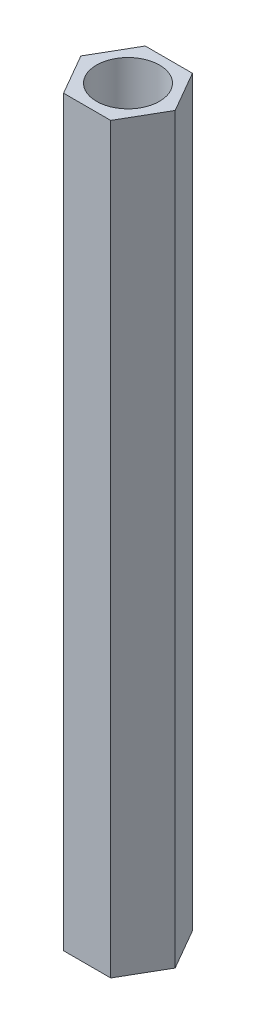
ISO-10303-21;
HEADER;
FILE_DESCRIPTION(('STEP AP214'),'2;1');
FILE_NAME('part.step','',(''),(''),'','','');
FILE_SCHEMA(('AUTOMOTIVE_DESIGN { 1 0 10303 214 1 1 1 1 }'));
ENDSEC;
DATA;
#1=APPLICATION_CONTEXT('core data for automotive mechanical design processes');
#2=APPLICATION_PROTOCOL_DEFINITION('international standard','automotive_design',2000,#1);
#3=PRODUCT_CONTEXT('',#1,'mechanical');
#4=PRODUCT('Part','Part','',(#3));
#5=PRODUCT_RELATED_PRODUCT_CATEGORY('part','',(#4));
#6=PRODUCT_DEFINITION_FORMATION('','',#4);
#7=PRODUCT_DEFINITION_CONTEXT('part definition',#1,'design');
#8=PRODUCT_DEFINITION('design','',#6,#7);
#9=PRODUCT_DEFINITION_SHAPE('','',#8);
#10=(LENGTH_UNIT() NAMED_UNIT(*) SI_UNIT(.MILLI.,.METRE.));
#11=(NAMED_UNIT(*) PLANE_ANGLE_UNIT() SI_UNIT($,.RADIAN.));
#12=(NAMED_UNIT(*) SI_UNIT($,.STERADIAN.) SOLID_ANGLE_UNIT());
#13=UNCERTAINTY_MEASURE_WITH_UNIT(LENGTH_MEASURE(1.E-05),#10,'distance_accuracy_value','');
#14=(GEOMETRIC_REPRESENTATION_CONTEXT(3) GLOBAL_UNCERTAINTY_ASSIGNED_CONTEXT((#13)) GLOBAL_UNIT_ASSIGNED_CONTEXT((#10,
#11,#12)) REPRESENTATION_CONTEXT('',''));
#15=CARTESIAN_POINT('',(0.,0.,0.));
#16=DIRECTION('',(0.,0.,1.));
#17=DIRECTION('',(1.,0.,0.));
#18=AXIS2_PLACEMENT_3D('',#15,#16,#17);
#19=CARTESIAN_POINT('',(0.952627944162881,30.,1.65000000000002));
#20=DIRECTION('',(-0.866025403784439,0.,-0.499999999999999));
#21=DIRECTION('',(-0.499999999999999,0.,0.866025403784439));
#22=AXIS2_PLACEMENT_3D('',#19,#20,#21);
#23=PLANE('',#22);
#24=DIRECTION('',(0.499999999999999,0.,-0.866025403784439));
#25=VECTOR('',#24,1.);
#26=CARTESIAN_POINT('',(0.952627944162881,0.,1.65000000000002));
#27=LINE('',#26,#25);
#28=CARTESIAN_POINT('',(0.952627944162881,0.,1.65000000000002));
#29=VERTEX_POINT('',#28);
#30=CARTESIAN_POINT('',(1.90525588832577,0.,0.));
#31=VERTEX_POINT('',#30);
#32=EDGE_CURVE('E117',#29,#31,#27,.T.);
#33=ORIENTED_EDGE('',*,*,#32,.T.);
#34=DIRECTION('',(0.,-1.,0.));
#35=VECTOR('',#34,1.);
#36=CARTESIAN_POINT('',(1.90525588832577,30.,0.));
#37=LINE('',#36,#35);
#38=CARTESIAN_POINT('',(1.90525588832577,30.,0.));
#39=VERTEX_POINT('',#38);
#40=EDGE_CURVE('E11',#39,#31,#37,.T.);
#41=ORIENTED_EDGE('',*,*,#40,.F.);
#42=DIRECTION('',(0.499999999999999,0.,-0.866025403784439));
#43=VECTOR('',#42,1.);
#44=CARTESIAN_POINT('',(0.952627944162881,30.,1.65000000000002));
#45=LINE('',#44,#43);
#46=CARTESIAN_POINT('',(0.952627944162881,30.,1.65000000000002));
#47=VERTEX_POINT('',#46);
#48=EDGE_CURVE('E128',#47,#39,#45,.T.);
#49=ORIENTED_EDGE('',*,*,#48,.F.);
#50=DIRECTION('',(0.,-1.,0.));
#51=VECTOR('',#50,1.);
#52=CARTESIAN_POINT('',(0.952627944162881,30.,1.65000000000002));
#53=LINE('',#52,#51);
#54=EDGE_CURVE('E113',#47,#29,#53,.T.);
#55=ORIENTED_EDGE('',*,*,#54,.T.);
#56=EDGE_LOOP('',(#33,#41,#49,#55));
#57=FACE_BOUND('',#56,.T.);
#58=ADVANCED_FACE('F33',(#57),#23,.F.);
#59=CARTESIAN_POINT('',(1.90525588832577,30.,0.));
#60=DIRECTION('',(-0.866025403784438,0.,0.500000000000002));
#61=DIRECTION('',(0.500000000000002,0.,0.866025403784438));
#62=AXIS2_PLACEMENT_3D('',#59,#60,#61);
#63=PLANE('',#62);
#64=DIRECTION('',(-0.500000000000002,0.,-0.866025403784437));
#65=VECTOR('',#64,1.);
#66=CARTESIAN_POINT('',(1.90525588832577,0.,0.));
#67=LINE('',#66,#65);
#68=CARTESIAN_POINT('',(0.952627944162867,0.,-1.65000000000002));
#69=VERTEX_POINT('',#68);
#70=EDGE_CURVE('E120',#31,#69,#67,.T.);
#71=ORIENTED_EDGE('',*,*,#70,.T.);
#72=DIRECTION('',(0.,-1.,0.));
#73=VECTOR('',#72,1.);
#74=CARTESIAN_POINT('',(0.952627944162867,30.,-1.65000000000002));
#75=LINE('',#74,#73);
#76=CARTESIAN_POINT('',(0.952627944162867,30.,-1.65000000000002));
#77=VERTEX_POINT('',#76);
#78=EDGE_CURVE('E41',#77,#69,#75,.T.);
#79=ORIENTED_EDGE('',*,*,#78,.F.);
#80=DIRECTION('',(-0.500000000000002,0.,-0.866025403784437));
#81=VECTOR('',#80,1.);
#82=CARTESIAN_POINT('',(1.90525588832577,30.,0.));
#83=LINE('',#82,#81);
#84=EDGE_CURVE('E86',#39,#77,#83,.T.);
#85=ORIENTED_EDGE('',*,*,#84,.F.);
#86=ORIENTED_EDGE('',*,*,#40,.T.);
#87=EDGE_LOOP('',(#71,#79,#85,#86));
#88=FACE_BOUND('',#87,.T.);
#89=ADVANCED_FACE('F153',(#88),#63,.F.);
#90=CARTESIAN_POINT('',(0.952627944162867,30.,-1.65000000000002));
#91=DIRECTION('',(0.,0.,1.));
#92=DIRECTION('',(1.,0.,0.));
#93=AXIS2_PLACEMENT_3D('',#90,#91,#92);
#94=PLANE('',#93);
#95=DIRECTION('',(-1.,0.,0.));
#96=VECTOR('',#95,1.);
#97=CARTESIAN_POINT('',(0.952627944162867,0.,-1.65000000000002));
#98=LINE('',#97,#96);
#99=CARTESIAN_POINT('',(-0.952627944162891,0.,-1.65000000000002));
#100=VERTEX_POINT('',#99);
#101=EDGE_CURVE('E123',#69,#100,#98,.T.);
#102=ORIENTED_EDGE('',*,*,#101,.T.);
#103=DIRECTION('',(0.,-1.,0.));
#104=VECTOR('',#103,1.);
#105=CARTESIAN_POINT('',(-0.952627944162891,30.,-1.65000000000002));
#106=LINE('',#105,#104);
#107=CARTESIAN_POINT('',(-0.952627944162891,30.,-1.65000000000002));
#108=VERTEX_POINT('',#107);
#109=EDGE_CURVE('E108',#108,#100,#106,.T.);
#110=ORIENTED_EDGE('',*,*,#109,.F.);
#111=DIRECTION('',(-1.,0.,0.));
#112=VECTOR('',#111,1.);
#113=CARTESIAN_POINT('',(0.952627944162867,30.,-1.65000000000002));
#114=LINE('',#113,#112);
#115=EDGE_CURVE('E99',#77,#108,#114,.T.);
#116=ORIENTED_EDGE('',*,*,#115,.F.);
#117=ORIENTED_EDGE('',*,*,#78,.T.);
#118=EDGE_LOOP('',(#102,#110,#116,#117));
#119=FACE_BOUND('',#118,.T.);
#120=ADVANCED_FACE('F134',(#119),#94,.F.);
#121=CARTESIAN_POINT('',(-0.952627944162891,30.,-1.65000000000002));
#122=DIRECTION('',(0.866025403784439,0.,0.499999999999999));
#123=DIRECTION('',(0.5,0.,-0.866025403784439));
#124=AXIS2_PLACEMENT_3D('',#121,#122,#123);
#125=PLANE('',#124);
#126=DIRECTION('',(-0.5,0.,0.866025403784439));
#127=VECTOR('',#126,1.);
#128=CARTESIAN_POINT('',(-0.952627944162891,0.,-1.65000000000002));
#129=LINE('',#128,#127);
#130=CARTESIAN_POINT('',(-1.90525588832578,0.,0.));
#131=VERTEX_POINT('',#130);
#132=EDGE_CURVE('E107',#100,#131,#129,.T.);
#133=ORIENTED_EDGE('',*,*,#132,.T.);
#134=DIRECTION('',(0.,-1.,0.));
#135=VECTOR('',#134,1.);
#136=CARTESIAN_POINT('',(-1.90525588832578,30.,0.));
#137=LINE('',#136,#135);
#138=CARTESIAN_POINT('',(-1.90525588832578,30.,0.));
#139=VERTEX_POINT('',#138);
#140=EDGE_CURVE('E104',#139,#131,#137,.T.);
#141=ORIENTED_EDGE('',*,*,#140,.F.);
#142=DIRECTION('',(-0.5,0.,0.866025403784439));
#143=VECTOR('',#142,1.);
#144=CARTESIAN_POINT('',(-0.952627944162891,30.,-1.65000000000002));
#145=LINE('',#144,#143);
#146=EDGE_CURVE('E93',#108,#139,#145,.T.);
#147=ORIENTED_EDGE('',*,*,#146,.F.);
#148=ORIENTED_EDGE('',*,*,#109,.T.);
#149=EDGE_LOOP('',(#133,#141,#147,#148));
#150=FACE_BOUND('',#149,.T.);
#151=ADVANCED_FACE('F105',(#150),#125,.F.);
#152=CARTESIAN_POINT('',(-1.90525588832578,30.,0.));
#153=DIRECTION('',(0.86602540378444,0.,-0.499999999999998));
#154=DIRECTION('',(-0.499999999999998,0.,-0.86602540378444));
#155=AXIS2_PLACEMENT_3D('',#152,#153,#154);
#156=PLANE('',#155);
#157=DIRECTION('',(0.499999999999998,0.,0.86602540378444));
#158=VECTOR('',#157,1.);
#159=CARTESIAN_POINT('',(-1.90525588832578,0.,0.));
#160=LINE('',#159,#158);
#161=CARTESIAN_POINT('',(-0.952627944162891,0.,1.65000000000002));
#162=VERTEX_POINT('',#161);
#163=EDGE_CURVE('E72',#131,#162,#160,.T.);
#164=ORIENTED_EDGE('',*,*,#163,.T.);
#165=DIRECTION('',(0.,-1.,0.));
#166=VECTOR('',#165,1.);
#167=CARTESIAN_POINT('',(-0.952627944162891,30.,1.65000000000002));
#168=LINE('',#167,#166);
#169=CARTESIAN_POINT('',(-0.952627944162891,30.,1.65000000000002));
#170=VERTEX_POINT('',#169);
#171=EDGE_CURVE('E109',#170,#162,#168,.T.);
#172=ORIENTED_EDGE('',*,*,#171,.F.);
#173=DIRECTION('',(0.499999999999998,0.,0.86602540378444));
#174=VECTOR('',#173,1.);
#175=CARTESIAN_POINT('',(-1.90525588832578,30.,0.));
#176=LINE('',#175,#174);
#177=EDGE_CURVE('E97',#139,#170,#176,.T.);
#178=ORIENTED_EDGE('',*,*,#177,.F.);
#179=ORIENTED_EDGE('',*,*,#140,.T.);
#180=EDGE_LOOP('',(#164,#172,#178,#179));
#181=FACE_BOUND('',#180,.T.);
#182=ADVANCED_FACE('F111',(#181),#156,.F.);
#183=CARTESIAN_POINT('',(-0.952627944162891,30.,1.65000000000002));
#184=DIRECTION('',(0.,0.,-1.));
#185=DIRECTION('',(-1.,0.,0.));
#186=AXIS2_PLACEMENT_3D('',#183,#184,#185);
#187=PLANE('',#186);
#188=DIRECTION('',(1.,0.,0.));
#189=VECTOR('',#188,1.);
#190=CARTESIAN_POINT('',(-0.952627944162891,0.,1.65000000000002));
#191=LINE('',#190,#189);
#192=EDGE_CURVE('E78',#162,#29,#191,.T.);
#193=ORIENTED_EDGE('',*,*,#192,.T.);
#194=ORIENTED_EDGE('',*,*,#54,.F.);
#195=DIRECTION('',(1.,0.,0.));
#196=VECTOR('',#195,1.);
#197=CARTESIAN_POINT('',(-0.952627944162891,30.,1.65000000000002));
#198=LINE('',#197,#196);
#199=EDGE_CURVE('E49',#170,#47,#198,.T.);
#200=ORIENTED_EDGE('',*,*,#199,.F.);
#201=ORIENTED_EDGE('',*,*,#171,.T.);
#202=EDGE_LOOP('',(#193,#194,#200,#201));
#203=FACE_BOUND('',#202,.T.);
#204=ADVANCED_FACE('F141',(#203),#187,.F.);
#205=CARTESIAN_POINT('',(0.,30.,0.));
#206=DIRECTION('',(0.,1.,0.));
#207=DIRECTION('',(0.,0.,1.));
#208=AXIS2_PLACEMENT_3D('',#205,#206,#207);
#209=PLANE('',#208);
#210=CARTESIAN_POINT('',(0.,30.,0.));
#211=DIRECTION('',(0.,1.,0.));
#212=DIRECTION('',(0.,0.,1.));
#213=AXIS2_PLACEMENT_3D('',#210,#211,#212);
#214=CIRCLE('',#213,1.27161304615697);
#215=CARTESIAN_POINT('',(0.,30.,1.27161304615697));
#216=VERTEX_POINT('',#215);
#217=EDGE_CURVE('E208',#216,#216,#214,.T.);
#218=ORIENTED_EDGE('',*,*,#217,.F.);
#219=EDGE_LOOP('',(#218));
#220=FACE_BOUND('',#219,.T.);
#221=ORIENTED_EDGE('',*,*,#48,.T.);
#222=ORIENTED_EDGE('',*,*,#84,.T.);
#223=ORIENTED_EDGE('',*,*,#115,.T.);
#224=ORIENTED_EDGE('',*,*,#146,.T.);
#225=ORIENTED_EDGE('',*,*,#177,.T.);
#226=ORIENTED_EDGE('',*,*,#199,.T.);
#227=EDGE_LOOP('',(#221,#222,#223,#224,#225,#226));
#228=FACE_BOUND('',#227,.T.);
#229=ADVANCED_FACE('F95',(#220,#228),#209,.T.);
#230=CARTESIAN_POINT('',(0.,0.,0.));
#231=DIRECTION('',(0.,1.,0.));
#232=DIRECTION('',(0.,0.,1.));
#233=AXIS2_PLACEMENT_3D('',#230,#231,#232);
#234=PLANE('',#233);
#235=CARTESIAN_POINT('',(0.,0.,0.));
#236=DIRECTION('',(0.,1.,0.));
#237=DIRECTION('',(0.,0.,1.));
#238=AXIS2_PLACEMENT_3D('',#235,#236,#237);
#239=CIRCLE('',#238,1.27161304615697);
#240=CARTESIAN_POINT('',(0.,0.,1.27161304615697));
#241=VERTEX_POINT('',#240);
#242=EDGE_CURVE('E121',#241,#241,#239,.T.);
#243=ORIENTED_EDGE('',*,*,#242,.T.);
#244=EDGE_LOOP('',(#243));
#245=FACE_BOUND('',#244,.T.);
#246=ORIENTED_EDGE('',*,*,#32,.F.);
#247=ORIENTED_EDGE('',*,*,#192,.F.);
#248=ORIENTED_EDGE('',*,*,#163,.F.);
#249=ORIENTED_EDGE('',*,*,#132,.F.);
#250=ORIENTED_EDGE('',*,*,#101,.F.);
#251=ORIENTED_EDGE('',*,*,#70,.F.);
#252=EDGE_LOOP('',(#246,#247,#248,#249,#250,#251));
#253=FACE_BOUND('',#252,.T.);
#254=ADVANCED_FACE('F137',(#245,#253),#234,.F.);
#255=CARTESIAN_POINT('',(0.,0.,0.));
#256=DIRECTION('',(0.,1.,0.));
#257=DIRECTION('',(0.,0.,1.));
#258=AXIS2_PLACEMENT_3D('',#255,#256,#257);
#259=CYLINDRICAL_SURFACE('',#258,1.27161304615697);
#260=ORIENTED_EDGE('',*,*,#242,.F.);
#261=EDGE_LOOP('',(#260));
#262=FACE_BOUND('',#261,.T.);
#263=ORIENTED_EDGE('',*,*,#217,.T.);
#264=EDGE_LOOP('',(#263));
#265=FACE_BOUND('',#264,.T.);
#266=ADVANCED_FACE('F190',(#262,#265),#259,.F.);
#267=CLOSED_SHELL('',(#58,#89,#120,#151,#182,#204,#229,#254,#266));
#268=MANIFOLD_SOLID_BREP('B2',#267);
#269=ADVANCED_BREP_SHAPE_REPRESENTATION('',(#18,#268),#14);
#270=SHAPE_DEFINITION_REPRESENTATION(#9,#269);
ENDSEC;
END-ISO-10303-21;
